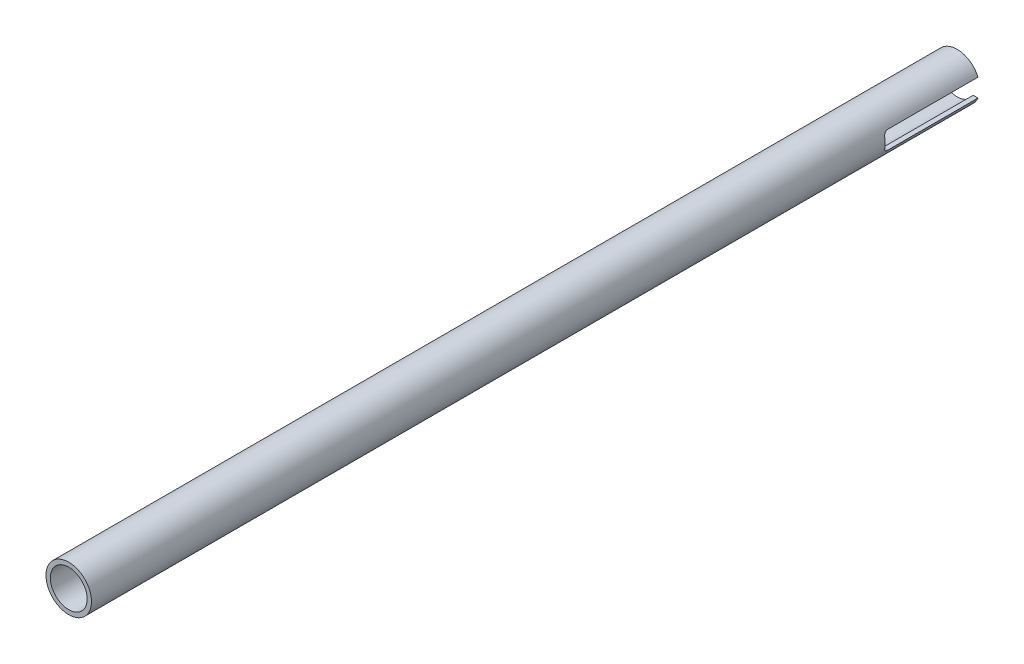
ISO-10303-21;
HEADER;
FILE_DESCRIPTION(('STEP AP214'),'2;1');
FILE_NAME('part.step','',(''),(''),'','','');
FILE_SCHEMA(('AUTOMOTIVE_DESIGN { 1 0 10303 214 1 1 1 1 }'));
ENDSEC;
DATA;
#1=APPLICATION_CONTEXT('core data for automotive mechanical design processes');
#2=APPLICATION_PROTOCOL_DEFINITION('international standard','automotive_design',2000,#1);
#3=PRODUCT_CONTEXT('',#1,'mechanical');
#4=PRODUCT('Part','Part','',(#3));
#5=PRODUCT_RELATED_PRODUCT_CATEGORY('part','',(#4));
#6=PRODUCT_DEFINITION_FORMATION('','',#4);
#7=PRODUCT_DEFINITION_CONTEXT('part definition',#1,'design');
#8=PRODUCT_DEFINITION('design','',#6,#7);
#9=PRODUCT_DEFINITION_SHAPE('','',#8);
#10=(LENGTH_UNIT() NAMED_UNIT(*) SI_UNIT(.MILLI.,.METRE.));
#11=(NAMED_UNIT(*) PLANE_ANGLE_UNIT() SI_UNIT($,.RADIAN.));
#12=(NAMED_UNIT(*) SI_UNIT($,.STERADIAN.) SOLID_ANGLE_UNIT());
#13=UNCERTAINTY_MEASURE_WITH_UNIT(LENGTH_MEASURE(1.E-05),#10,'distance_accuracy_value','');
#14=(GEOMETRIC_REPRESENTATION_CONTEXT(3) GLOBAL_UNCERTAINTY_ASSIGNED_CONTEXT((#13)) GLOBAL_UNIT_ASSIGNED_CONTEXT((#10,
#11,#12)) REPRESENTATION_CONTEXT('',''));
#15=CARTESIAN_POINT('',(0.,0.,0.));
#16=DIRECTION('',(0.,0.,1.));
#17=DIRECTION('',(1.,0.,0.));
#18=AXIS2_PLACEMENT_3D('',#15,#16,#17);
#19=CARTESIAN_POINT('',(0.,0.,0.));
#20=DIRECTION('',(0.,0.,1.));
#21=DIRECTION('',(1.00000000000001,0.,0.));
#22=AXIS2_PLACEMENT_3D('',#19,#20,#21);
#23=PLANE('',#22);
#24=DIRECTION('',(-1.00000000000001,0.,0.));
#25=VECTOR('',#24,1.);
#26=CARTESIAN_POINT('',(401.549427926423,-3.17499999999972,-4.44089209850063E-13));
#27=LINE('',#26,#25);
#28=CARTESIAN_POINT('',(7.34407080575883,-3.17500000000001,-3.33066907387547E-13));
#29=VERTEX_POINT('',#28);
#30=CARTESIAN_POINT('',(5.64543213580662,-3.17500000000001,-7.7715611723761E-13));
#31=VERTEX_POINT('',#30);
#32=EDGE_CURVE('E75',#29,#31,#27,.T.);
#33=ORIENTED_EDGE('',*,*,#32,.F.);
#34=CARTESIAN_POINT('',(0.,0.,0.));
#35=DIRECTION('',(0.,0.,1.));
#36=DIRECTION('',(1.00000000000001,0.,0.));
#37=AXIS2_PLACEMENT_3D('',#34,#35,#36);
#38=CIRCLE('',#37,8.001);
#39=CARTESIAN_POINT('',(-7.34407080575908,-3.17500000000023,-6.66133814775094E-13));
#40=VERTEX_POINT('',#39);
#41=EDGE_CURVE('E166',#40,#29,#38,.T.);
#42=ORIENTED_EDGE('',*,*,#41,.F.);
#43=CARTESIAN_POINT('',(-5.64543213580712,-3.17500000000009,3.33066907387547E-13));
#44=VERTEX_POINT('',#43);
#45=EDGE_CURVE('E160',#44,#40,#27,.T.);
#46=ORIENTED_EDGE('',*,*,#45,.F.);
#47=CARTESIAN_POINT('',(0.,0.,0.));
#48=DIRECTION('',(0.,0.,1.));
#49=DIRECTION('',(1.00000000000001,0.,0.));
#50=AXIS2_PLACEMENT_3D('',#47,#48,#49);
#51=CIRCLE('',#50,6.477);
#52=EDGE_CURVE('E272',#44,#31,#51,.T.);
#53=ORIENTED_EDGE('',*,*,#52,.T.);
#54=EDGE_LOOP('',(#33,#42,#46,#53));
#55=FACE_BOUND('',#54,.T.);
#56=ADVANCED_FACE('F50',(#55),#23,.F.);
#57=CARTESIAN_POINT('',(-6.66133814775094E-13,0.,312.42));
#58=DIRECTION('',(0.,0.,-1.));
#59=DIRECTION('',(-1.00000000000001,0.,0.));
#60=AXIS2_PLACEMENT_3D('',#57,#58,#59);
#61=CYLINDRICAL_SURFACE('',#60,8.001);
#62=CARTESIAN_POINT('',(-6.66133814775094E-13,0.,312.42));
#63=DIRECTION('',(0.,0.,1.));
#64=DIRECTION('',(1.00000000000001,0.,0.));
#65=AXIS2_PLACEMENT_3D('',#62,#63,#64);
#66=CIRCLE('',#65,8.001);
#67=CARTESIAN_POINT('',(8.00099999999938,0.,312.42));
#68=VERTEX_POINT('',#67);
#69=EDGE_CURVE('E281',#68,#68,#66,.T.);
#70=ORIENTED_EDGE('',*,*,#69,.F.);
#71=EDGE_LOOP('',(#70));
#72=FACE_BOUND('',#71,.T.);
#73=DIRECTION('',(0.,0.,-1.));
#74=VECTOR('',#73,1.);
#75=CARTESIAN_POINT('',(7.34407080575838,3.17499999999991,312.42));
#76=LINE('',#75,#74);
#77=CARTESIAN_POINT('',(7.34407080575894,3.175,0.));
#78=VERTEX_POINT('',#77);
#79=CARTESIAN_POINT('',(7.34407080575866,3.17500000000001,31.7499999999999));
#80=VERTEX_POINT('',#79);
#81=EDGE_CURVE('E266',#78,#80,#76,.F.);
#82=ORIENTED_EDGE('',*,*,#81,.F.);
#83=CARTESIAN_POINT('',(-7.344070805759,3.17499999999991,2.22044604925031E-13));
#84=VERTEX_POINT('',#83);
#85=EDGE_CURVE('E286',#78,#84,#38,.T.);
#86=ORIENTED_EDGE('',*,*,#85,.T.);
#87=DIRECTION('',(0.,0.,-1.));
#88=VECTOR('',#87,1.);
#89=CARTESIAN_POINT('',(-7.34407080575966,3.17499999999986,312.42));
#90=LINE('',#89,#88);
#91=CARTESIAN_POINT('',(-7.34407080575919,3.17500000000008,31.7499999999995));
#92=VERTEX_POINT('',#91);
#93=EDGE_CURVE('E269',#92,#84,#90,.T.);
#94=ORIENTED_EDGE('',*,*,#93,.F.);
#95=CARTESIAN_POINT('',(-7.82880578377096,1.65100000000012,33.274));
#96=CARTESIAN_POINT('',(-7.81947795268371,1.69524181564522,33.2739996807886));
#97=CARTESIAN_POINT('',(-7.80977555287409,1.73937906238708,33.2720725755952));
#98=CARTESIAN_POINT('',(-7.78970531909641,1.82715995012293,33.2644259194218));
#99=CARTESIAN_POINT('',(-7.77933765259966,1.87080371211598,33.2587073195395));
#100=CARTESIAN_POINT('',(-7.74740781787885,2.00038689143377,33.2359920832164));
#101=CARTESIAN_POINT('',(-7.72497172734679,2.08520038066883,33.2134353611238));
#102=CARTESIAN_POINT('',(-7.67879255624791,2.24931803273234,33.1543529357351));
#103=CARTESIAN_POINT('',(-7.65505009243343,2.32862475603202,33.1178337766215));
#104=CARTESIAN_POINT('',(-7.60739952527363,2.479871441366,33.031840393531));
#105=CARTESIAN_POINT('',(-7.58349136309842,2.55180862700721,32.9823613118312));
#106=CARTESIAN_POINT('',(-7.53640113822534,2.68773877112472,32.8705553900398));
#107=CARTESIAN_POINT('',(-7.51324222932305,2.75155008701057,32.8079974672162));
#108=CARTESIAN_POINT('',(-7.46969556535525,2.86766507697709,32.6721080561477));
#109=CARTESIAN_POINT('',(-7.44930787514784,2.91996848174229,32.5987763158341));
#110=CARTESIAN_POINT('',(-7.41339882631993,3.00995182097473,32.4453560568204));
#111=CARTESIAN_POINT('',(-7.39775949227171,3.04799299625036,32.3655075680514));
#112=CARTESIAN_POINT('',(-7.37198636942689,3.10981595853757,32.1996963126833));
#113=CARTESIAN_POINT('',(-7.36184321814938,3.13362200161657,32.1137442276382));
#114=CARTESIAN_POINT('',(-7.35134082404817,3.15814271182933,31.9807481495915));
#115=CARTESIAN_POINT('',(-7.34862226710197,3.16445643648453,31.9348527548853));
#116=CARTESIAN_POINT('',(-7.34498545577265,3.17288497032049,31.8426477775764));
#117=CARTESIAN_POINT('',(-7.34406565426169,3.17500338794736,31.7963385853606));
#118=CARTESIAN_POINT('',(-7.34407080575919,3.17500000000008,31.7499999999995));
#119=B_SPLINE_CURVE_WITH_KNOTS('',3,(#95,#96,#97,#98,#99,#100,#101,#102,#103,#104,#105,#106,
#107,#108,#109,#110,#111,#112,#113,#114,#115,#116,#117,#118),.UNSPECIFIED.,.F.,.F.,(4,2,2,2,2,2,
2,2,2,2,2,4),(0.,0.135553024626167,0.271072058592243,0.541437670457895,0.811676717226427,
1.0820172020755,1.35761362878659,1.63321650449505,1.90127196271367,2.16886935439242,
2.3078905012207,2.44679202186548),.UNSPECIFIED.);
#120=CARTESIAN_POINT('',(-7.82880578377082,1.65100000000003,33.2739999999996));
#121=VERTEX_POINT('',#120);
#122=EDGE_CURVE('E252',#121,#92,#119,.T.);
#123=ORIENTED_EDGE('',*,*,#122,.F.);
#124=CARTESIAN_POINT('',(-3.60822483003176E-13,0.,33.2740000000002));
#125=DIRECTION('',(0.,0.,-1.));
#126=DIRECTION('',(-1.00000000000001,0.,0.));
#127=AXIS2_PLACEMENT_3D('',#124,#125,#126);
#128=CIRCLE('',#127,8.001);
#129=CARTESIAN_POINT('',(-7.8288057837709,-1.65099999999994,33.2740000000002));
#130=VERTEX_POINT('',#129);
#131=EDGE_CURVE('E153',#130,#121,#128,.T.);
#132=ORIENTED_EDGE('',*,*,#131,.F.);
#133=CARTESIAN_POINT('',(-7.34407080575902,-3.17500000000011,31.7499999999993));
#134=CARTESIAN_POINT('',(-7.34406800969147,-3.17500157818651,31.7906984476081));
#135=CARTESIAN_POINT('',(-7.34477630214695,-3.17336860893202,31.8313759502425));
#136=CARTESIAN_POINT('',(-7.3475830914401,-3.16686635956932,31.9124114079672));
#137=CARTESIAN_POINT('',(-7.34968118035494,-3.16199802907917,31.9527694533059));
#138=CARTESIAN_POINT('',(-7.357988575802,-3.14264423927052,32.0726338560658));
#139=CARTESIAN_POINT('',(-7.36621159330738,-3.12340930879265,32.1512906881801));
#140=CARTESIAN_POINT('',(-7.38735918413204,-3.0730536606059,32.3038993996983));
#141=CARTESIAN_POINT('',(-7.40028060607305,-3.04194090905541,32.3778543938123));
#142=CARTESIAN_POINT('',(-7.42988157799959,-2.96890708335146,32.5194453435946));
#143=CARTESIAN_POINT('',(-7.44656372650478,-2.92697853298672,32.5870768840644));
#144=CARTESIAN_POINT('',(-7.48338951433565,-2.83153727514395,32.7173193992743));
#145=CARTESIAN_POINT('',(-7.50365176960166,-2.77760154335592,32.7795861247465));
#146=CARTESIAN_POINT('',(-7.54586923311716,-2.66077336101825,32.8943978381574));
#147=CARTESIAN_POINT('',(-7.56782510086101,-2.59787741319578,32.9469390116054));
#148=CARTESIAN_POINT('',(-7.61377353576117,-2.46009532987569,33.0444249056495));
#149=CARTESIAN_POINT('',(-7.63780327629274,-2.38468542927387,33.0886132632454));
#150=CARTESIAN_POINT('',(-7.68517828309964,-2.22728162943202,33.1635295949971));
#151=CARTESIAN_POINT('',(-7.70852388215325,-2.14529100625109,33.1942642181982));
#152=CARTESIAN_POINT('',(-7.74866065435349,-1.99473307846584,33.2363269168585));
#153=CARTESIAN_POINT('',(-7.76579152458555,-1.92700882203652,33.2503889784841));
#154=CARTESIAN_POINT('',(-7.79853598216484,-1.78994063052691,33.269233672255));
#155=CARTESIAN_POINT('',(-7.81414985826868,-1.72059700681897,33.2740180736833));
#156=CARTESIAN_POINT('',(-7.8288057837709,-1.65099999999994,33.2740000000002));
#157=B_SPLINE_CURVE_WITH_KNOTS('',3,(#133,#134,#135,#136,#137,#138,#139,#140,#141,#142,#143,
#144,#145,#146,#147,#148,#149,#150,#151,#152,#153,#154,#155,#156),.UNSPECIFIED.,.F.,.F.,(4,2,2,
2,2,2,2,2,2,2,2,4),(0.,0.122015614312848,0.243995431359319,0.486888996423636,0.729619944201931,
0.972519126749725,1.2259371183264,1.47945429417238,1.75015649231447,2.02072475375013,
2.23388433321191,2.44700325838176),.UNSPECIFIED.);
#158=CARTESIAN_POINT('',(-7.34407080575902,-3.17500000000011,31.7499999999993));
#159=VERTEX_POINT('',#158);
#160=EDGE_CURVE('E154',#159,#130,#157,.T.);
#161=ORIENTED_EDGE('',*,*,#160,.F.);
#162=DIRECTION('',(0.,0.,-1.));
#163=VECTOR('',#162,1.);
#164=CARTESIAN_POINT('',(-7.3440708057595,-3.17500000000003,312.42));
#165=LINE('',#164,#163);
#166=EDGE_CURVE('E168',#40,#159,#165,.F.);
#167=ORIENTED_EDGE('',*,*,#166,.F.);
#168=ORIENTED_EDGE('',*,*,#41,.T.);
#169=DIRECTION('',(0.,0.,-1.));
#170=VECTOR('',#169,1.);
#171=CARTESIAN_POINT('',(7.34407080575869,-3.17500000000008,312.42));
#172=LINE('',#171,#170);
#173=CARTESIAN_POINT('',(7.34407080575877,-3.17500000000009,31.7499999999998));
#174=VERTEX_POINT('',#173);
#175=EDGE_CURVE('E157',#174,#29,#172,.T.);
#176=ORIENTED_EDGE('',*,*,#175,.F.);
#177=CARTESIAN_POINT('',(7.8288057837706,-1.65100000000021,33.2739999999996));
#178=CARTESIAN_POINT('',(7.8194779526833,-1.69524181564529,33.2739996807883));
#179=CARTESIAN_POINT('',(7.80977555287365,-1.73937906238713,33.2720725755949));
#180=CARTESIAN_POINT('',(7.78970531909593,-1.82715995012296,33.2644259194216));
#181=CARTESIAN_POINT('',(7.77933765259918,-1.870803712116,33.2587073195393));
#182=CARTESIAN_POINT('',(7.74740781787845,-2.00038689143377,33.2359920832162));
#183=CARTESIAN_POINT('',(7.72497172734657,-2.08520038066883,33.2134353611236));
#184=CARTESIAN_POINT('',(7.67879255624768,-2.24931803273234,33.1543529357349));
#185=CARTESIAN_POINT('',(7.65505009243301,-2.32862475603202,33.1178337766214));
#186=CARTESIAN_POINT('',(7.60739952527315,-2.47987144136599,33.0318403935309));
#187=CARTESIAN_POINT('',(7.58349136309807,-2.55180862700718,32.982361311831));
#188=CARTESIAN_POINT('',(7.53640113822498,-2.68773877112474,32.8705553900396));
#189=CARTESIAN_POINT('',(7.51324222932255,-2.75155008701066,32.8079974672161));
#190=CARTESIAN_POINT('',(7.46969556535478,-2.86766507697724,32.6721080561477));
#191=CARTESIAN_POINT('',(7.44930787514753,-2.91996848174243,32.598776315834));
#192=CARTESIAN_POINT('',(7.41339882631959,-3.00995182097484,32.4453560568205));
#193=CARTESIAN_POINT('',(7.39775949227119,-3.04799299625048,32.3655075680516));
#194=CARTESIAN_POINT('',(7.37198636942646,-3.10981595853764,32.1996963126837));
#195=CARTESIAN_POINT('',(7.36184321814922,-3.13362200161658,32.1137442276387));
#196=CARTESIAN_POINT('',(7.35134082404787,-3.15814271182947,31.9807481495921));
#197=CARTESIAN_POINT('',(7.34862226710152,-3.16445643648475,31.9348527548858));
#198=CARTESIAN_POINT('',(7.34498545577202,-3.17288497032075,31.8426477775768));
#199=CARTESIAN_POINT('',(7.34406565426104,-3.17500338794758,31.796338585361));
#200=CARTESIAN_POINT('',(7.34407080575872,-3.17500000000012,31.7499999999998));
#201=B_SPLINE_CURVE_WITH_KNOTS('',3,(#177,#178,#179,#180,#181,#182,#183,#184,#185,#186,#187,
#188,#189,#190,#191,#192,#193,#194,#195,#196,#197,#198,#199,#200),.UNSPECIFIED.,.F.,.F.,(4,2,2,
2,2,2,2,2,2,2,2,4),(0.,0.135553024626149,0.271072058592193,0.541437670457731,0.811676717226304,
1.08201720207544,1.35761362878653,1.63321650449498,1.90127196271328,2.16886935439171,
2.30789050122017,2.44679202186513),.UNSPECIFIED.);
#202=CARTESIAN_POINT('',(7.8288057837706,-1.65100000000021,33.2739999999996));
#203=VERTEX_POINT('',#202);
#204=EDGE_CURVE('E142',#203,#174,#201,.T.);
#205=ORIENTED_EDGE('',*,*,#204,.F.);
#206=CARTESIAN_POINT('',(7.82880578377032,1.65099999999986,33.2739999999995));
#207=VERTEX_POINT('',#206);
#208=EDGE_CURVE('E259',#207,#203,#128,.T.);
#209=ORIENTED_EDGE('',*,*,#208,.F.);
#210=CARTESIAN_POINT('',(7.34407080575866,3.17500000000001,31.7499999999999));
#211=CARTESIAN_POINT('',(7.3440680096911,3.17500157818628,31.7906984476087));
#212=CARTESIAN_POINT('',(7.34477630214659,3.17336860893172,31.8313759502431));
#213=CARTESIAN_POINT('',(7.34758309143976,3.16686635956895,31.9124114079678));
#214=CARTESIAN_POINT('',(7.3496811803546,3.1619980290788,31.9527694533065));
#215=CARTESIAN_POINT('',(7.35798857580164,3.14264423927015,32.0726338560664));
#216=CARTESIAN_POINT('',(7.36621159330694,3.12340930879232,32.1512906881808));
#217=CARTESIAN_POINT('',(7.38735918413157,3.07305366060561,32.3038993996987));
#218=CARTESIAN_POINT('',(7.40028060607262,3.04194090905515,32.3778543938126));
#219=CARTESIAN_POINT('',(7.42988157799919,2.96890708335128,32.5194453435944));
#220=CARTESIAN_POINT('',(7.44656372650436,2.92697853298658,32.5870768840641));
#221=CARTESIAN_POINT('',(7.48338951433519,2.83153727514386,32.7173193992739));
#222=CARTESIAN_POINT('',(7.5036517696012,2.7776015433558,32.7795861247462));
#223=CARTESIAN_POINT('',(7.54586923311669,2.66077336101821,32.8943978381576));
#224=CARTESIAN_POINT('',(7.56782510086054,2.59787741319585,32.9469390116059));
#225=CARTESIAN_POINT('',(7.61377353576066,2.4600953298757,33.0444249056501));
#226=CARTESIAN_POINT('',(7.63780327629219,2.3846854292737,33.0886132632456));
#227=CARTESIAN_POINT('',(7.6851782830993,2.22728162943186,33.1635295949972));
#228=CARTESIAN_POINT('',(7.70852388215317,2.1452910062511,33.1942642181984));
#229=CARTESIAN_POINT('',(7.74866065435336,1.99473307846591,33.2363269168589));
#230=CARTESIAN_POINT('',(7.76579152458522,1.92700882203654,33.2503889784844));
#231=CARTESIAN_POINT('',(7.7985359821642,1.78994063052683,33.2692336722551));
#232=CARTESIAN_POINT('',(7.81414985826791,1.72059700681886,33.274018073683));
#233=CARTESIAN_POINT('',(7.82880578377027,1.65099999999989,33.2739999999996));
#234=B_SPLINE_CURVE_WITH_KNOTS('',3,(#210,#211,#212,#213,#214,#215,#216,#217,#218,#219,#220,
#221,#222,#223,#224,#225,#226,#227,#228,#229,#230,#231,#232,#233),.UNSPECIFIED.,.F.,.F.,(4,2,2,
2,2,2,2,2,2,2,2,4),(0.,0.122015614312885,0.243995431359417,0.486888996423687,0.729619944201411,
0.972519126748704,1.22593711832574,1.47945429417201,1.75015649231402,2.02072475374963,
2.23388433321138,2.44700325838116),.UNSPECIFIED.);
#235=EDGE_CURVE('E258',#80,#207,#234,.T.);
#236=ORIENTED_EDGE('',*,*,#235,.F.);
#237=EDGE_LOOP('',(#82,#86,#94,#123,#132,#161,#167,#168,#176,#205,#209,#236));
#238=FACE_BOUND('',#237,.T.);
#239=ADVANCED_FACE('F52',(#72,#238),#61,.T.);
#240=CARTESIAN_POINT('',(-6.66133814775094E-13,0.,312.42));
#241=DIRECTION('',(0.,0.,-1.));
#242=DIRECTION('',(-1.00000000000001,0.,0.));
#243=AXIS2_PLACEMENT_3D('',#240,#241,#242);
#244=CYLINDRICAL_SURFACE('',#243,6.477);
#245=CARTESIAN_POINT('',(-6.66133814775094E-13,0.,312.42));
#246=DIRECTION('',(0.,0.,1.));
#247=DIRECTION('',(1.00000000000001,0.,0.));
#248=AXIS2_PLACEMENT_3D('',#245,#246,#247);
#249=CIRCLE('',#248,6.477);
#250=CARTESIAN_POINT('',(6.47699999999937,0.,312.42));
#251=VERTEX_POINT('',#250);
#252=EDGE_CURVE('E273',#251,#251,#249,.T.);
#253=ORIENTED_EDGE('',*,*,#252,.T.);
#254=EDGE_LOOP('',(#253));
#255=FACE_BOUND('',#254,.T.);
#256=CARTESIAN_POINT('',(5.64543213580676,3.17499999999969,-9.99200722162641E-13));
#257=VERTEX_POINT('',#256);
#258=CARTESIAN_POINT('',(-5.6454321358069,3.17500000000008,0.));
#259=VERTEX_POINT('',#258);
#260=EDGE_CURVE('E277',#257,#259,#51,.T.);
#261=ORIENTED_EDGE('',*,*,#260,.F.);
#262=DIRECTION('',(0.,0.,-1.));
#263=VECTOR('',#262,1.);
#264=CARTESIAN_POINT('',(5.64543213580618,3.17499999999982,312.42));
#265=LINE('',#264,#263);
#266=CARTESIAN_POINT('',(5.64543213580682,3.17499999999997,31.7499999999999));
#267=VERTEX_POINT('',#266);
#268=EDGE_CURVE('E13',#257,#267,#265,.F.);
#269=ORIENTED_EDGE('',*,*,#268,.T.);
#270=CARTESIAN_POINT('',(5.64543213580682,3.17499999999997,31.7499999999999));
#271=CARTESIAN_POINT('',(5.64542798532424,3.17500253012479,31.7895022750382));
#272=CARTESIAN_POINT('',(5.64629676751108,3.17346305780174,31.8289831851794));
#273=CARTESIAN_POINT('',(5.64973489172741,3.1673401059692,31.9076163338366));
#274=CARTESIAN_POINT('',(5.65230347216171,3.16275798971422,31.9467687115993));
#275=CARTESIAN_POINT('',(5.66245282356215,3.14457608288709,32.0629070155866));
#276=CARTESIAN_POINT('',(5.67247830845159,3.12653965087161,32.1390381879884));
#277=CARTESIAN_POINT('',(5.6981495747415,3.07950075965739,32.2866255007943));
#278=CARTESIAN_POINT('',(5.71378770060086,3.05051323473273,32.3580878532039));
#279=CARTESIAN_POINT('',(5.74949312759955,2.98267072120716,32.4950337996195));
#280=CARTESIAN_POINT('',(5.769565434279,2.94380457356395,32.5605105176717));
#281=CARTESIAN_POINT('',(5.81427344287299,2.85454020484129,32.6883725064166));
#282=CARTESIAN_POINT('',(5.8391229401548,2.80355001313477,32.7502682413197));
#283=CARTESIAN_POINT('',(5.89090094280722,2.69305400468476,32.8649190340708));
#284=CARTESIAN_POINT('',(5.91783040535216,2.63354425646489,32.9176698468723));
#285=CARTESIAN_POINT('',(5.97540269204164,2.50037980782318,33.0183991647779));
#286=CARTESIAN_POINT('',(6.00613015030667,2.42589024924408,33.06522944935));
#287=CARTESIAN_POINT('',(6.06685054178942,2.26977298542582,33.1454912659981));
#288=CARTESIAN_POINT('',(6.0968437976714,2.18814849062344,33.1789287868608));
#289=CARTESIAN_POINT('',(6.15068954263667,2.03135452128186,33.2277262918858));
#290=CARTESIAN_POINT('',(6.17481721444672,1.95685658409067,33.2449485076855));
#291=CARTESIAN_POINT('',(6.22080900465616,1.80539896583249,33.2681012531508));
#292=CARTESIAN_POINT('',(6.24267154884629,1.728437620737,33.2740239790664));
#293=CARTESIAN_POINT('',(6.26304462701638,1.65099999999989,33.2739999999989));
#294=B_SPLINE_CURVE_WITH_KNOTS('',3,(#270,#271,#272,#273,#274,#275,#276,#277,#278,#279,#280,
#281,#282,#283,#284,#285,#286,#287,#288,#289,#290,#291,#292,#293),.UNSPECIFIED.,.F.,.F.,(4,2,2,
2,2,2,2,2,2,2,2,4),(0.,0.118426117882324,0.236799210794772,0.472172634306445,0.707226225251467,
0.942546525606287,1.19340365391747,1.44437691938338,1.72272641785918,2.00095130860642,
2.2406452178062,2.48050460661585),.UNSPECIFIED.);
#295=CARTESIAN_POINT('',(6.26304462701627,1.65099999999989,33.273999999999));
#296=VERTEX_POINT('',#295);
#297=EDGE_CURVE('E60',#267,#296,#294,.T.);
#298=ORIENTED_EDGE('',*,*,#297,.T.);
#299=CARTESIAN_POINT('',(-3.60822483003176E-13,0.,33.2740000000002));
#300=DIRECTION('',(0.,0.,-1.));
#301=DIRECTION('',(-1.00000000000001,0.,0.));
#302=AXIS2_PLACEMENT_3D('',#299,#300,#301);
#303=CIRCLE('',#302,6.477);
#304=CARTESIAN_POINT('',(6.26304462701616,-1.65100000000007,33.2739999999992));
#305=VERTEX_POINT('',#304);
#306=EDGE_CURVE('E214',#296,#305,#303,.T.);
#307=ORIENTED_EDGE('',*,*,#306,.T.);
#308=CARTESIAN_POINT('',(6.26304462701616,-1.65100000000007,33.2739999999992));
#309=CARTESIAN_POINT('',(6.25119301356574,-1.69597019045459,33.273999651292));
#310=CARTESIAN_POINT('',(6.2388580501524,-1.74078424361488,33.272008765398));
#311=CARTESIAN_POINT('',(6.21333080831789,-1.82980515275706,33.2641341389404));
#312=CARTESIAN_POINT('',(6.20013884930364,-1.87401222760585,33.2582518413055));
#313=CARTESIAN_POINT('',(6.15951133396868,-2.00506101361783,33.2349457970158));
#314=CARTESIAN_POINT('',(6.13094979172368,-2.09061085165544,33.2118617467995));
#315=CARTESIAN_POINT('',(6.07212151471618,-2.25578612168248,33.1516219603263));
#316=CARTESIAN_POINT('',(6.04185654214352,-2.33541748531379,33.1144805465839));
#317=CARTESIAN_POINT('',(5.98100165398754,-2.48713337520241,33.0271532445199));
#318=CARTESIAN_POINT('',(5.95041151302857,-2.55921223237764,32.9769576544585));
#319=CARTESIAN_POINT('',(5.88959770370031,-2.69629003214936,32.8627307014109));
#320=CARTESIAN_POINT('',(5.85942026108709,-2.76097278644592,32.7982938275103));
#321=CARTESIAN_POINT('',(5.80262181829016,-2.87843237174361,32.6579375307768));
#322=CARTESIAN_POINT('',(5.77600068690905,-2.93120964200456,32.5820185317565));
#323=CARTESIAN_POINT('',(5.72961508062215,-3.02084256755086,32.4238173863486));
#324=CARTESIAN_POINT('',(5.70961192114559,-3.05826802843459,32.3419300118509));
#325=CARTESIAN_POINT('',(5.67705818777065,-3.11828924116528,32.171590943874));
#326=CARTESIAN_POINT('',(5.66448853762415,-3.14092296814994,32.0831567140413));
#327=CARTESIAN_POINT('',(5.6527480181779,-3.16196375608029,31.9530428647805));
#328=CARTESIAN_POINT('',(5.65001234622008,-3.16684526064375,31.9126313476026));
#329=CARTESIAN_POINT('',(5.64635324825512,-3.1733629663773,31.8314890576689));
#330=CARTESIAN_POINT('',(5.64542881846782,-3.17500096508532,31.7907584743115));
#331=CARTESIAN_POINT('',(5.64543213580648,-3.17500000000008,31.7499999999994));
#332=B_SPLINE_CURVE_WITH_KNOTS('',3,(#308,#309,#310,#311,#312,#313,#314,#315,#316,#317,#318,
#319,#320,#321,#322,#323,#324,#325,#326,#327,#328,#329,#330,#331),.UNSPECIFIED.,.F.,.F.,(4,2,2,
2,2,2,2,2,2,2,2,4),(0.,0.139419976741691,0.278788285754474,0.556665652256905,0.834260658887502,
1.1120625639992,1.39912695233702,1.6861807475331,1.96132294859858,2.23575596690124,
2.35800176569011,2.48017979736552),.UNSPECIFIED.);
#333=CARTESIAN_POINT('',(5.64543213580684,-3.17500000000004,31.7499999999999));
#334=VERTEX_POINT('',#333);
#335=EDGE_CURVE('E207',#305,#334,#332,.T.);
#336=ORIENTED_EDGE('',*,*,#335,.T.);
#337=DIRECTION('',(0.,0.,-1.));
#338=VECTOR('',#337,1.);
#339=CARTESIAN_POINT('',(5.6454321358062,-3.17500000000001,312.42));
#340=LINE('',#339,#338);
#341=EDGE_CURVE('E158',#334,#31,#340,.T.);
#342=ORIENTED_EDGE('',*,*,#341,.T.);
#343=ORIENTED_EDGE('',*,*,#52,.F.);
#344=DIRECTION('',(0.,0.,-1.));
#345=VECTOR('',#344,1.);
#346=CARTESIAN_POINT('',(-5.64543213580737,-3.17500000000005,312.42));
#347=LINE('',#346,#345);
#348=CARTESIAN_POINT('',(-5.64543213580704,-3.17500000000016,31.7499999999992));
#349=VERTEX_POINT('',#348);
#350=EDGE_CURVE('E285',#44,#349,#347,.F.);
#351=ORIENTED_EDGE('',*,*,#350,.T.);
#352=CARTESIAN_POINT('',(-5.64543213580704,-3.17500000000016,31.7499999999992));
#353=CARTESIAN_POINT('',(-5.64542798532454,-3.17500253012507,31.7895022750376));
#354=CARTESIAN_POINT('',(-5.6462967675114,-3.17346305780205,31.8289831851789));
#355=CARTESIAN_POINT('',(-5.64973489172776,-3.16734010596953,31.9076163338363));
#356=CARTESIAN_POINT('',(-5.65230347216206,-3.16275798971453,31.9467687115991));
#357=CARTESIAN_POINT('',(-5.66245282356252,-3.14457608288732,32.0629070155867));
#358=CARTESIAN_POINT('',(-5.67247830845205,-3.12653965087178,32.1390381879887));
#359=CARTESIAN_POINT('',(-5.69814957474201,-3.07950075965745,32.2866255007947));
#360=CARTESIAN_POINT('',(-5.71378770060133,-3.05051323473278,32.3580878532043));
#361=CARTESIAN_POINT('',(-5.74949312760006,-2.98267072120718,32.4950337996198));
#362=CARTESIAN_POINT('',(-5.7695654342796,-2.94380457356395,32.5605105176719));
#363=CARTESIAN_POINT('',(-5.81427344287366,-2.85454020484121,32.6883725064167));
#364=CARTESIAN_POINT('',(-5.83912294015543,-2.80355001313463,32.7502682413198));
#365=CARTESIAN_POINT('',(-5.89090094280766,-2.69305400468474,32.8649190340711));
#366=CARTESIAN_POINT('',(-5.91783040535245,-2.63354425646506,32.9176698468728));
#367=CARTESIAN_POINT('',(-5.97540269204189,-2.5003798078234,33.0183991647784));
#368=CARTESIAN_POINT('',(-6.00613015030707,-2.42589024924414,33.0652294493501));
#369=CARTESIAN_POINT('',(-6.06685054179,-2.26977298542582,33.1454912659979));
#370=CARTESIAN_POINT('',(-6.09684379767202,-2.18814849062354,33.1789287868608));
#371=CARTESIAN_POINT('',(-6.15068954263726,-2.031354521282,33.2277262918857));
#372=CARTESIAN_POINT('',(-6.17481721444726,-1.95685658409077,33.2449485076853));
#373=CARTESIAN_POINT('',(-6.22080900465654,-1.8053989658326,33.2681012531506));
#374=CARTESIAN_POINT('',(-6.24267154884658,-1.72843762073715,33.2740239790663));
#375=CARTESIAN_POINT('',(-6.26304462701657,-1.65100000000017,33.2739999999994));
#376=B_SPLINE_CURVE_WITH_KNOTS('',3,(#352,#353,#354,#355,#356,#357,#358,#359,#360,#361,#362,
#363,#364,#365,#366,#367,#368,#369,#370,#371,#372,#373,#374,#375),.UNSPECIFIED.,.F.,.F.,(4,2,2,
2,2,2,2,2,2,2,2,4),(0.,0.118426117882662,0.236799210795439,0.472172634307656,0.707226225252586,
0.942546525607396,1.19340365391855,1.44437691938437,1.72272641786008,2.00095130860733,
2.24064521780705,2.48050460661649),.UNSPECIFIED.);
#377=CARTESIAN_POINT('',(-6.26304462701657,-1.65100000000017,33.2739999999994));
#378=VERTEX_POINT('',#377);
#379=EDGE_CURVE('E197',#349,#378,#376,.T.);
#380=ORIENTED_EDGE('',*,*,#379,.T.);
#381=CARTESIAN_POINT('',(-6.26304462701693,1.65099999999989,33.2739999999997));
#382=VERTEX_POINT('',#381);
#383=EDGE_CURVE('E240',#378,#382,#303,.T.);
#384=ORIENTED_EDGE('',*,*,#383,.T.);
#385=CARTESIAN_POINT('',(-6.26304462701693,1.65099999999989,33.2739999999997));
#386=CARTESIAN_POINT('',(-6.25119301356634,1.69597019045436,33.2739996512923));
#387=CARTESIAN_POINT('',(-6.23885805015293,1.74078424361468,33.2720087653982));
#388=CARTESIAN_POINT('',(-6.21333080831837,1.82980515275689,33.2641341389406));
#389=CARTESIAN_POINT('',(-6.20013884930415,1.87401222760568,33.2582518413058));
#390=CARTESIAN_POINT('',(-6.15951133396917,2.00506101361769,33.2349457970159));
#391=CARTESIAN_POINT('',(-6.13094979172406,2.09061085165518,33.2118617467989));
#392=CARTESIAN_POINT('',(-6.07212151471651,2.25578612168232,33.1516219603256));
#393=CARTESIAN_POINT('',(-6.04185654214388,2.33541748531386,33.1144805465837));
#394=CARTESIAN_POINT('',(-5.98100165398798,2.48713337520254,33.0271532445201));
#395=CARTESIAN_POINT('',(-5.95041151302905,2.55921223237762,32.9769576544585));
#396=CARTESIAN_POINT('',(-5.8895977037008,2.69629003214927,32.8627307014107));
#397=CARTESIAN_POINT('',(-5.85942026108754,2.7609727864459,32.7982938275102));
#398=CARTESIAN_POINT('',(-5.80262181829061,2.87843237174356,32.6579375307767));
#399=CARTESIAN_POINT('',(-5.77600068690955,2.93120964200438,32.5820185317562));
#400=CARTESIAN_POINT('',(-5.72961508062265,3.02084256755069,32.4238173863482));
#401=CARTESIAN_POINT('',(-5.70961192114605,3.05826802843453,32.3419300118504));
#402=CARTESIAN_POINT('',(-5.67705818777109,3.11828924116526,32.1715909438734));
#403=CARTESIAN_POINT('',(-5.66448853762462,3.14092296814984,32.0831567140406));
#404=CARTESIAN_POINT('',(-5.65274801817842,3.16196375608007,31.9530428647799));
#405=CARTESIAN_POINT('',(-5.65001234622063,3.16684526064349,31.9126313476021));
#406=CARTESIAN_POINT('',(-5.64635324825571,3.17336296637705,31.8314890576686));
#407=CARTESIAN_POINT('',(-5.64542881846843,3.17500096508513,31.7907584743113));
#408=CARTESIAN_POINT('',(-5.64543213580712,3.17500000000003,31.7499999999994));
#409=B_SPLINE_CURVE_WITH_KNOTS('',3,(#385,#386,#387,#388,#389,#390,#391,#392,#393,#394,#395,
#396,#397,#398,#399,#400,#401,#402,#403,#404,#405,#406,#407,#408),.UNSPECIFIED.,.F.,.F.,(4,2,2,
2,2,2,2,2,2,2,2,4),(0.,0.139419976741795,0.278788285754538,0.556665652257288,0.834260658887826,
1.11206256399937,1.39912695233724,1.68618074753344,1.96132294859913,2.23575596690197,
2.35800176569051,2.48017979736558),.UNSPECIFIED.);
#410=CARTESIAN_POINT('',(-5.64543213580712,3.17500000000003,31.7499999999994));
#411=VERTEX_POINT('',#410);
#412=EDGE_CURVE('E232',#382,#411,#409,.T.);
#413=ORIENTED_EDGE('',*,*,#412,.T.);
#414=DIRECTION('',(0.,0.,-1.));
#415=VECTOR('',#414,1.);
#416=CARTESIAN_POINT('',(-5.64543213580759,3.17499999999982,312.42));
#417=LINE('',#416,#415);
#418=EDGE_CURVE('E239',#411,#259,#417,.T.);
#419=ORIENTED_EDGE('',*,*,#418,.T.);
#420=EDGE_LOOP('',(#261,#269,#298,#307,#336,#342,#343,#351,#380,#384,#413,#419));
#421=FACE_BOUND('',#420,.T.);
#422=ADVANCED_FACE('F220',(#255,#421),#244,.F.);
#423=CARTESIAN_POINT('',(-6.66133814775094E-13,0.,312.42));
#424=DIRECTION('',(0.,0.,1.));
#425=DIRECTION('',(1.00000000000001,0.,0.));
#426=AXIS2_PLACEMENT_3D('',#423,#424,#425);
#427=PLANE('',#426);
#428=ORIENTED_EDGE('',*,*,#69,.T.);
#429=EDGE_LOOP('',(#428));
#430=FACE_BOUND('',#429,.T.);
#431=ORIENTED_EDGE('',*,*,#252,.F.);
#432=EDGE_LOOP('',(#431));
#433=FACE_BOUND('',#432,.T.);
#434=ADVANCED_FACE('F225',(#430,#433),#427,.T.);
#435=ORIENTED_EDGE('',*,*,#85,.F.);
#436=DIRECTION('',(-1.00000000000001,0.,0.));
#437=VECTOR('',#436,1.);
#438=CARTESIAN_POINT('',(401.549427926423,3.17500000000025,-1.66533453693773E-12));
#439=LINE('',#438,#437);
#440=EDGE_CURVE('E174',#78,#257,#439,.T.);
#441=ORIENTED_EDGE('',*,*,#440,.T.);
#442=ORIENTED_EDGE('',*,*,#260,.T.);
#443=EDGE_CURVE('E317',#259,#84,#439,.T.);
#444=ORIENTED_EDGE('',*,*,#443,.T.);
#445=EDGE_LOOP('',(#435,#441,#442,#444));
#446=FACE_BOUND('',#445,.T.);
#447=ADVANCED_FACE('F366',(#446),#23,.F.);
#448=CARTESIAN_POINT('',(401.549427926423,-3.17499999999998,31.749999999999));
#449=DIRECTION('',(0.,0.999999999999996,0.));
#450=DIRECTION('',(0.,0.,1.));
#451=AXIS2_PLACEMENT_3D('',#448,#449,#450);
#452=PLANE('',#451);
#453=ORIENTED_EDGE('',*,*,#45,.T.);
#454=ORIENTED_EDGE('',*,*,#166,.T.);
#455=DIRECTION('',(-1.00000000000001,0.,0.));
#456=VECTOR('',#455,1.);
#457=CARTESIAN_POINT('',(401.549427926423,-3.17499999999998,31.749999999999));
#458=LINE('',#457,#456);
#459=EDGE_CURVE('E67',#349,#159,#458,.T.);
#460=ORIENTED_EDGE('',*,*,#459,.F.);
#461=ORIENTED_EDGE('',*,*,#350,.F.);
#462=EDGE_LOOP('',(#453,#454,#460,#461));
#463=FACE_BOUND('',#462,.T.);
#464=ADVANCED_FACE('F391',(#463),#452,.T.);
#465=CARTESIAN_POINT('',(401.549427926423,-1.65099999999985,31.7499999999987));
#466=DIRECTION('',(-1.00000000000001,0.,0.));
#467=DIRECTION('',(0.,0.,1.));
#468=AXIS2_PLACEMENT_3D('',#465,#466,#467);
#469=CYLINDRICAL_SURFACE('',#468,1.524);
#470=ORIENTED_EDGE('',*,*,#459,.T.);
#471=ORIENTED_EDGE('',*,*,#160,.T.);
#472=DIRECTION('',(-1.00000000000001,0.,0.));
#473=VECTOR('',#472,1.);
#474=CARTESIAN_POINT('',(401.549427926423,-1.65099999999985,33.273999999999));
#475=LINE('',#474,#473);
#476=EDGE_CURVE('E330',#378,#130,#475,.T.);
#477=ORIENTED_EDGE('',*,*,#476,.F.);
#478=ORIENTED_EDGE('',*,*,#379,.F.);
#479=EDGE_LOOP('',(#470,#471,#477,#478));
#480=FACE_BOUND('',#479,.T.);
#481=ADVANCED_FACE('F192',(#480),#469,.F.);
#482=CARTESIAN_POINT('',(401.549427926423,1.65100000000014,33.2739999999989));
#483=DIRECTION('',(0.,0.,-1.));
#484=DIRECTION('',(-1.00000000000001,0.,0.));
#485=AXIS2_PLACEMENT_3D('',#482,#483,#484);
#486=PLANE('',#485);
#487=ORIENTED_EDGE('',*,*,#476,.T.);
#488=ORIENTED_EDGE('',*,*,#131,.T.);
#489=DIRECTION('',(-1.00000000000001,0.,0.));
#490=VECTOR('',#489,1.);
#491=CARTESIAN_POINT('',(401.549427926423,1.65100000000014,33.2739999999989));
#492=LINE('',#491,#490);
#493=EDGE_CURVE('E326',#382,#121,#492,.T.);
#494=ORIENTED_EDGE('',*,*,#493,.F.);
#495=ORIENTED_EDGE('',*,*,#383,.F.);
#496=EDGE_LOOP('',(#487,#488,#494,#495));
#497=FACE_BOUND('',#496,.T.);
#498=ADVANCED_FACE('F355',(#497),#486,.T.);
#499=CARTESIAN_POINT('',(401.549427926423,1.65100000000017,31.7499999999989));
#500=DIRECTION('',(-1.00000000000001,0.,0.));
#501=DIRECTION('',(0.,0.,1.));
#502=AXIS2_PLACEMENT_3D('',#499,#500,#501);
#503=CYLINDRICAL_SURFACE('',#502,1.524);
#504=ORIENTED_EDGE('',*,*,#493,.T.);
#505=ORIENTED_EDGE('',*,*,#122,.T.);
#506=DIRECTION('',(-1.00000000000001,0.,0.));
#507=VECTOR('',#506,1.);
#508=CARTESIAN_POINT('',(401.549427926423,3.17500000000032,31.7499999999988));
#509=LINE('',#508,#507);
#510=EDGE_CURVE('E318',#411,#92,#509,.T.);
#511=ORIENTED_EDGE('',*,*,#510,.F.);
#512=ORIENTED_EDGE('',*,*,#412,.F.);
#513=EDGE_LOOP('',(#504,#505,#511,#512));
#514=FACE_BOUND('',#513,.T.);
#515=ADVANCED_FACE('F246',(#514),#503,.F.);
#516=CARTESIAN_POINT('',(401.549427926423,3.17500000000025,-1.66533453693773E-12));
#517=DIRECTION('',(0.,-0.999999999999996,0.));
#518=DIRECTION('',(0.,0.,-0.999999999999999));
#519=AXIS2_PLACEMENT_3D('',#516,#517,#518);
#520=PLANE('',#519);
#521=ORIENTED_EDGE('',*,*,#510,.T.);
#522=ORIENTED_EDGE('',*,*,#93,.T.);
#523=ORIENTED_EDGE('',*,*,#443,.F.);
#524=ORIENTED_EDGE('',*,*,#418,.F.);
#525=EDGE_LOOP('',(#521,#522,#523,#524));
#526=FACE_BOUND('',#525,.T.);
#527=ADVANCED_FACE('F227',(#526),#520,.T.);
#528=ORIENTED_EDGE('',*,*,#440,.F.);
#529=ORIENTED_EDGE('',*,*,#81,.T.);
#530=EDGE_CURVE('E310',#80,#267,#509,.T.);
#531=ORIENTED_EDGE('',*,*,#530,.T.);
#532=ORIENTED_EDGE('',*,*,#268,.F.);
#533=EDGE_LOOP('',(#528,#529,#531,#532));
#534=FACE_BOUND('',#533,.T.);
#535=ADVANCED_FACE('F244',(#534),#520,.T.);
#536=ORIENTED_EDGE('',*,*,#530,.F.);
#537=ORIENTED_EDGE('',*,*,#235,.T.);
#538=EDGE_CURVE('E313',#207,#296,#492,.T.);
#539=ORIENTED_EDGE('',*,*,#538,.T.);
#540=ORIENTED_EDGE('',*,*,#297,.F.);
#541=EDGE_LOOP('',(#536,#537,#539,#540));
#542=FACE_BOUND('',#541,.T.);
#543=ADVANCED_FACE('F241',(#542),#503,.F.);
#544=ORIENTED_EDGE('',*,*,#538,.F.);
#545=ORIENTED_EDGE('',*,*,#208,.T.);
#546=EDGE_CURVE('E148',#203,#305,#475,.T.);
#547=ORIENTED_EDGE('',*,*,#546,.T.);
#548=ORIENTED_EDGE('',*,*,#306,.F.);
#549=EDGE_LOOP('',(#544,#545,#547,#548));
#550=FACE_BOUND('',#549,.T.);
#551=ADVANCED_FACE('F191',(#550),#486,.T.);
#552=ORIENTED_EDGE('',*,*,#546,.F.);
#553=ORIENTED_EDGE('',*,*,#204,.T.);
#554=EDGE_CURVE('E145',#174,#334,#458,.T.);
#555=ORIENTED_EDGE('',*,*,#554,.T.);
#556=ORIENTED_EDGE('',*,*,#335,.F.);
#557=EDGE_LOOP('',(#552,#553,#555,#556));
#558=FACE_BOUND('',#557,.T.);
#559=ADVANCED_FACE('F144',(#558),#469,.F.);
#560=ORIENTED_EDGE('',*,*,#554,.F.);
#561=ORIENTED_EDGE('',*,*,#175,.T.);
#562=ORIENTED_EDGE('',*,*,#32,.T.);
#563=ORIENTED_EDGE('',*,*,#341,.F.);
#564=EDGE_LOOP('',(#560,#561,#562,#563));
#565=FACE_BOUND('',#564,.T.);
#566=ADVANCED_FACE('F156',(#565),#452,.T.);
#567=CLOSED_SHELL('',(#56,#239,#422,#434,#447,#464,#481,#498,#515,#527,#535,#543,#551,#559,#566));
#568=MANIFOLD_SOLID_BREP('B2',#567);
#569=ADVANCED_BREP_SHAPE_REPRESENTATION('',(#18,#568),#14);
#570=SHAPE_DEFINITION_REPRESENTATION(#9,#569);
ENDSEC;
END-ISO-10303-21;
